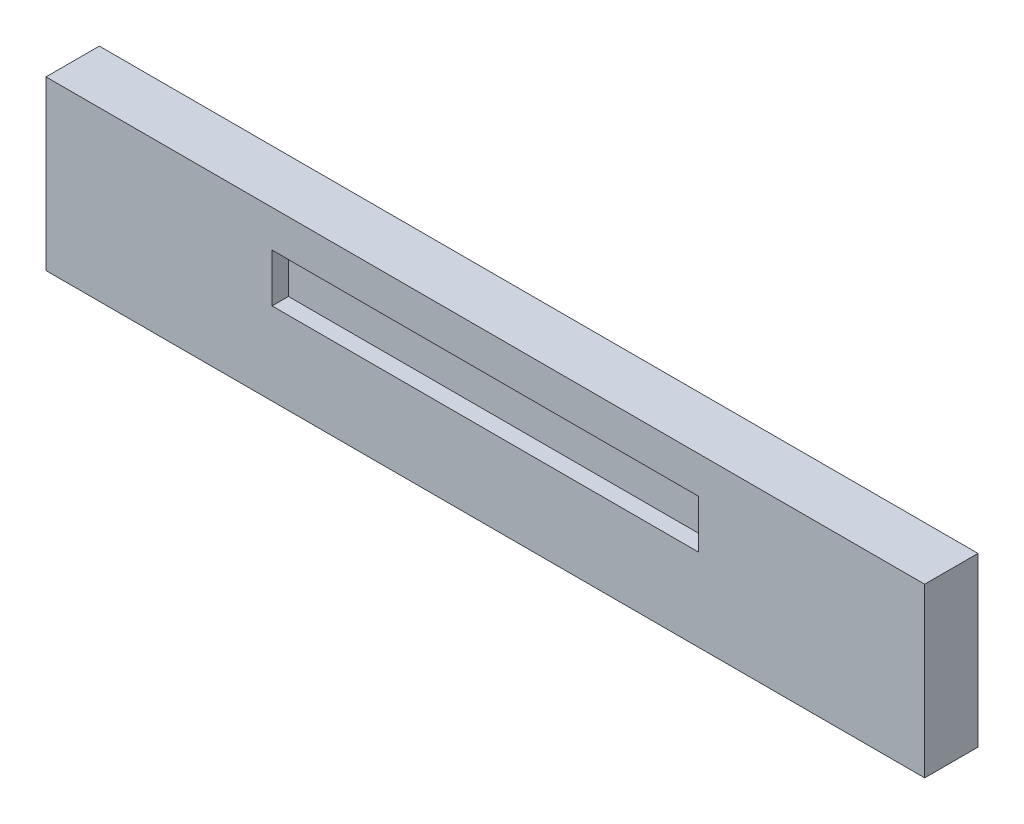
ISO-10303-21;
HEADER;
FILE_DESCRIPTION(('STEP AP214'),'2;1');
FILE_NAME('part.step','',(''),(''),'','','');
FILE_SCHEMA(('AUTOMOTIVE_DESIGN { 1 0 10303 214 1 1 1 1 }'));
ENDSEC;
DATA;
#1=APPLICATION_CONTEXT('core data for automotive mechanical design processes');
#2=APPLICATION_PROTOCOL_DEFINITION('international standard','automotive_design',2000,#1);
#3=PRODUCT_CONTEXT('',#1,'mechanical');
#4=PRODUCT('Part','Part','',(#3));
#5=PRODUCT_RELATED_PRODUCT_CATEGORY('part','',(#4));
#6=PRODUCT_DEFINITION_FORMATION('','',#4);
#7=PRODUCT_DEFINITION_CONTEXT('part definition',#1,'design');
#8=PRODUCT_DEFINITION('design','',#6,#7);
#9=PRODUCT_DEFINITION_SHAPE('','',#8);
#10=(LENGTH_UNIT() NAMED_UNIT(*) SI_UNIT(.MILLI.,.METRE.));
#11=(NAMED_UNIT(*) PLANE_ANGLE_UNIT() SI_UNIT($,.RADIAN.));
#12=(NAMED_UNIT(*) SI_UNIT($,.STERADIAN.) SOLID_ANGLE_UNIT());
#13=UNCERTAINTY_MEASURE_WITH_UNIT(LENGTH_MEASURE(1.E-05),#10,'distance_accuracy_value','');
#14=(GEOMETRIC_REPRESENTATION_CONTEXT(3) GLOBAL_UNCERTAINTY_ASSIGNED_CONTEXT((#13)) GLOBAL_UNIT_ASSIGNED_CONTEXT((#10,
#11,#12)) REPRESENTATION_CONTEXT('',''));
#15=CARTESIAN_POINT('',(0.,0.,0.));
#16=DIRECTION('',(0.,0.,1.));
#17=DIRECTION('',(1.,0.,0.));
#18=AXIS2_PLACEMENT_3D('',#15,#16,#17);
#19=CARTESIAN_POINT('',(0.,0.,38.5));
#20=DIRECTION('',(0.,0.,-1.));
#21=DIRECTION('',(-1.,0.,0.));
#22=AXIS2_PLACEMENT_3D('',#19,#20,#21);
#23=PLANE('',#22);
#24=DIRECTION('',(0.,-1.,0.));
#25=VECTOR('',#24,1.);
#26=CARTESIAN_POINT('',(0.,0.,38.5));
#27=LINE('',#26,#25);
#28=CARTESIAN_POINT('',(0.,118.,38.5));
#29=VERTEX_POINT('',#28);
#30=CARTESIAN_POINT('',(0.,0.,38.5));
#31=VERTEX_POINT('',#30);
#32=EDGE_CURVE('E145',#29,#31,#27,.T.);
#33=ORIENTED_EDGE('',*,*,#32,.T.);
#34=DIRECTION('',(1.,0.,0.));
#35=VECTOR('',#34,1.);
#36=CARTESIAN_POINT('',(0.,0.,38.5));
#37=LINE('',#36,#35);
#38=CARTESIAN_POINT('',(618.,0.,38.5));
#39=VERTEX_POINT('',#38);
#40=EDGE_CURVE('E92',#31,#39,#37,.T.);
#41=ORIENTED_EDGE('',*,*,#40,.T.);
#42=DIRECTION('',(0.,1.,0.));
#43=VECTOR('',#42,1.);
#44=CARTESIAN_POINT('',(618.,0.,38.5));
#45=LINE('',#44,#43);
#46=CARTESIAN_POINT('',(618.,118.,38.5));
#47=VERTEX_POINT('',#46);
#48=EDGE_CURVE('E148',#39,#47,#45,.T.);
#49=ORIENTED_EDGE('',*,*,#48,.T.);
#50=DIRECTION('',(-1.,0.,0.));
#51=VECTOR('',#50,1.);
#52=CARTESIAN_POINT('',(0.,118.,38.5));
#53=LINE('',#52,#51);
#54=EDGE_CURVE('E63',#47,#29,#53,.T.);
#55=ORIENTED_EDGE('',*,*,#54,.T.);
#56=EDGE_LOOP('',(#33,#41,#49,#55));
#57=FACE_BOUND('',#56,.T.);
#58=DIRECTION('',(0.,-1.,0.));
#59=VECTOR('',#58,1.);
#60=CARTESIAN_POINT('',(159.,0.,38.5));
#61=LINE('',#60,#59);
#62=CARTESIAN_POINT('',(159.,92.,38.5));
#63=VERTEX_POINT('',#62);
#64=CARTESIAN_POINT('',(159.,58.,38.5));
#65=VERTEX_POINT('',#64);
#66=EDGE_CURVE('E11',#63,#65,#61,.T.);
#67=ORIENTED_EDGE('',*,*,#66,.F.);
#68=DIRECTION('',(-1.,0.,0.));
#69=VECTOR('',#68,1.);
#70=CARTESIAN_POINT('',(0.,92.,38.5));
#71=LINE('',#70,#69);
#72=CARTESIAN_POINT('',(459.,92.,38.5));
#73=VERTEX_POINT('',#72);
#74=EDGE_CURVE('E167',#73,#63,#71,.T.);
#75=ORIENTED_EDGE('',*,*,#74,.F.);
#76=DIRECTION('',(0.,1.,0.));
#77=VECTOR('',#76,1.);
#78=CARTESIAN_POINT('',(459.,0.,38.5));
#79=LINE('',#78,#77);
#80=CARTESIAN_POINT('',(459.,58.,38.5));
#81=VERTEX_POINT('',#80);
#82=EDGE_CURVE('E169',#81,#73,#79,.T.);
#83=ORIENTED_EDGE('',*,*,#82,.F.);
#84=DIRECTION('',(1.,0.,0.));
#85=VECTOR('',#84,1.);
#86=CARTESIAN_POINT('',(0.,58.,38.5));
#87=LINE('',#86,#85);
#88=EDGE_CURVE('E47',#65,#81,#87,.T.);
#89=ORIENTED_EDGE('',*,*,#88,.F.);
#90=EDGE_LOOP('',(#67,#75,#83,#89));
#91=FACE_BOUND('',#90,.T.);
#92=ADVANCED_FACE('F39',(#57,#91),#23,.F.);
#93=CARTESIAN_POINT('',(0.,0.,38.5));
#94=DIRECTION('',(1.,0.,0.));
#95=DIRECTION('',(0.,0.,-1.));
#96=AXIS2_PLACEMENT_3D('',#93,#94,#95);
#97=PLANE('',#96);
#98=DIRECTION('',(0.,-1.,0.));
#99=VECTOR('',#98,1.);
#100=CARTESIAN_POINT('',(0.,0.,1.));
#101=LINE('',#100,#99);
#102=CARTESIAN_POINT('',(0.,118.,1.));
#103=VERTEX_POINT('',#102);
#104=CARTESIAN_POINT('',(0.,0.,1.));
#105=VERTEX_POINT('',#104);
#106=EDGE_CURVE('E122',#103,#105,#101,.T.);
#107=ORIENTED_EDGE('',*,*,#106,.T.);
#108=DIRECTION('',(0.,0.,-1.));
#109=VECTOR('',#108,1.);
#110=CARTESIAN_POINT('',(0.,0.,38.5));
#111=LINE('',#110,#109);
#112=EDGE_CURVE('E165',#31,#105,#111,.T.);
#113=ORIENTED_EDGE('',*,*,#112,.F.);
#114=ORIENTED_EDGE('',*,*,#32,.F.);
#115=DIRECTION('',(0.,0.,-1.));
#116=VECTOR('',#115,1.);
#117=CARTESIAN_POINT('',(0.,118.,38.5));
#118=LINE('',#117,#116);
#119=EDGE_CURVE('E151',#29,#103,#118,.T.);
#120=ORIENTED_EDGE('',*,*,#119,.T.);
#121=EDGE_LOOP('',(#107,#113,#114,#120));
#122=FACE_BOUND('',#121,.T.);
#123=ADVANCED_FACE('F41',(#122),#97,.F.);
#124=CARTESIAN_POINT('',(0.,0.,38.5));
#125=DIRECTION('',(0.,1.,0.));
#126=DIRECTION('',(0.,0.,1.));
#127=AXIS2_PLACEMENT_3D('',#124,#125,#126);
#128=PLANE('',#127);
#129=DIRECTION('',(1.,0.,0.));
#130=VECTOR('',#129,1.);
#131=CARTESIAN_POINT('',(0.,0.,1.));
#132=LINE('',#131,#130);
#133=CARTESIAN_POINT('',(618.,0.,1.));
#134=VERTEX_POINT('',#133);
#135=EDGE_CURVE('E154',#105,#134,#132,.T.);
#136=ORIENTED_EDGE('',*,*,#135,.T.);
#137=DIRECTION('',(0.,0.,-1.));
#138=VECTOR('',#137,1.);
#139=CARTESIAN_POINT('',(618.,0.,38.5));
#140=LINE('',#139,#138);
#141=EDGE_CURVE('E162',#39,#134,#140,.T.);
#142=ORIENTED_EDGE('',*,*,#141,.F.);
#143=ORIENTED_EDGE('',*,*,#40,.F.);
#144=ORIENTED_EDGE('',*,*,#112,.T.);
#145=EDGE_LOOP('',(#136,#142,#143,#144));
#146=FACE_BOUND('',#145,.T.);
#147=ADVANCED_FACE('F191',(#146),#128,.F.);
#148=CARTESIAN_POINT('',(618.,0.,38.5));
#149=DIRECTION('',(-1.,0.,0.));
#150=DIRECTION('',(0.,0.,1.));
#151=AXIS2_PLACEMENT_3D('',#148,#149,#150);
#152=PLANE('',#151);
#153=DIRECTION('',(0.,1.,0.));
#154=VECTOR('',#153,1.);
#155=CARTESIAN_POINT('',(618.,0.,1.));
#156=LINE('',#155,#154);
#157=CARTESIAN_POINT('',(618.,118.,1.));
#158=VERTEX_POINT('',#157);
#159=EDGE_CURVE('E156',#134,#158,#156,.T.);
#160=ORIENTED_EDGE('',*,*,#159,.T.);
#161=DIRECTION('',(0.,0.,-1.));
#162=VECTOR('',#161,1.);
#163=CARTESIAN_POINT('',(618.,118.,38.5));
#164=LINE('',#163,#162);
#165=EDGE_CURVE('E160',#47,#158,#164,.T.);
#166=ORIENTED_EDGE('',*,*,#165,.F.);
#167=ORIENTED_EDGE('',*,*,#48,.F.);
#168=ORIENTED_EDGE('',*,*,#141,.T.);
#169=EDGE_LOOP('',(#160,#166,#167,#168));
#170=FACE_BOUND('',#169,.T.);
#171=ADVANCED_FACE('F202',(#170),#152,.F.);
#172=CARTESIAN_POINT('',(0.,118.,38.5));
#173=DIRECTION('',(0.,-1.,0.));
#174=DIRECTION('',(0.,0.,-1.));
#175=AXIS2_PLACEMENT_3D('',#172,#173,#174);
#176=PLANE('',#175);
#177=DIRECTION('',(-1.,0.,0.));
#178=VECTOR('',#177,1.);
#179=CARTESIAN_POINT('',(0.,118.,1.));
#180=LINE('',#179,#178);
#181=EDGE_CURVE('E84',#158,#103,#180,.T.);
#182=ORIENTED_EDGE('',*,*,#181,.T.);
#183=ORIENTED_EDGE('',*,*,#119,.F.);
#184=ORIENTED_EDGE('',*,*,#54,.F.);
#185=ORIENTED_EDGE('',*,*,#165,.T.);
#186=EDGE_LOOP('',(#182,#183,#184,#185));
#187=FACE_BOUND('',#186,.T.);
#188=ADVANCED_FACE('F198',(#187),#176,.F.);
#189=CARTESIAN_POINT('',(0.,0.,1.));
#190=DIRECTION('',(0.,0.,-1.));
#191=DIRECTION('',(-1.,0.,0.));
#192=AXIS2_PLACEMENT_3D('',#189,#190,#191);
#193=PLANE('',#192);
#194=ORIENTED_EDGE('',*,*,#106,.F.);
#195=ORIENTED_EDGE('',*,*,#181,.F.);
#196=ORIENTED_EDGE('',*,*,#159,.F.);
#197=ORIENTED_EDGE('',*,*,#135,.F.);
#198=EDGE_LOOP('',(#194,#195,#196,#197));
#199=FACE_BOUND('',#198,.T.);
#200=ADVANCED_FACE('F196',(#199),#193,.T.);
#201=CARTESIAN_POINT('',(159.,58.,41.));
#202=DIRECTION('',(1.,0.,0.));
#203=DIRECTION('',(0.,0.,-1.));
#204=AXIS2_PLACEMENT_3D('',#201,#202,#203);
#205=PLANE('',#204);
#206=ORIENTED_EDGE('',*,*,#66,.T.);
#207=DIRECTION('',(0.,0.,-1.));
#208=VECTOR('',#207,1.);
#209=CARTESIAN_POINT('',(159.,58.,41.));
#210=LINE('',#209,#208);
#211=CARTESIAN_POINT('',(159.,58.,27.));
#212=VERTEX_POINT('',#211);
#213=EDGE_CURVE('E113',#65,#212,#210,.T.);
#214=ORIENTED_EDGE('',*,*,#213,.T.);
#215=DIRECTION('',(0.,-1.,0.));
#216=VECTOR('',#215,1.);
#217=CARTESIAN_POINT('',(159.,58.,27.));
#218=LINE('',#217,#216);
#219=CARTESIAN_POINT('',(159.,92.,27.));
#220=VERTEX_POINT('',#219);
#221=EDGE_CURVE('E118',#220,#212,#218,.T.);
#222=ORIENTED_EDGE('',*,*,#221,.F.);
#223=DIRECTION('',(0.,0.,-1.));
#224=VECTOR('',#223,1.);
#225=CARTESIAN_POINT('',(159.,92.,41.));
#226=LINE('',#225,#224);
#227=EDGE_CURVE('E141',#63,#220,#226,.T.);
#228=ORIENTED_EDGE('',*,*,#227,.F.);
#229=EDGE_LOOP('',(#206,#214,#222,#228));
#230=FACE_BOUND('',#229,.T.);
#231=ADVANCED_FACE('F115',(#230),#205,.T.);
#232=CARTESIAN_POINT('',(159.,58.,41.));
#233=DIRECTION('',(0.,1.,0.));
#234=DIRECTION('',(0.,0.,1.));
#235=AXIS2_PLACEMENT_3D('',#232,#233,#234);
#236=PLANE('',#235);
#237=ORIENTED_EDGE('',*,*,#88,.T.);
#238=DIRECTION('',(0.,0.,-1.));
#239=VECTOR('',#238,1.);
#240=CARTESIAN_POINT('',(459.,58.,41.));
#241=LINE('',#240,#239);
#242=CARTESIAN_POINT('',(459.,58.,27.));
#243=VERTEX_POINT('',#242);
#244=EDGE_CURVE('E123',#81,#243,#241,.T.);
#245=ORIENTED_EDGE('',*,*,#244,.T.);
#246=DIRECTION('',(1.,0.,0.));
#247=VECTOR('',#246,1.);
#248=CARTESIAN_POINT('',(159.,58.,27.));
#249=LINE('',#248,#247);
#250=EDGE_CURVE('E126',#212,#243,#249,.T.);
#251=ORIENTED_EDGE('',*,*,#250,.F.);
#252=ORIENTED_EDGE('',*,*,#213,.F.);
#253=EDGE_LOOP('',(#237,#245,#251,#252));
#254=FACE_BOUND('',#253,.T.);
#255=ADVANCED_FACE('F127',(#254),#236,.T.);
#256=CARTESIAN_POINT('',(459.,58.,41.));
#257=DIRECTION('',(-1.,0.,0.));
#258=DIRECTION('',(0.,0.,1.));
#259=AXIS2_PLACEMENT_3D('',#256,#257,#258);
#260=PLANE('',#259);
#261=ORIENTED_EDGE('',*,*,#82,.T.);
#262=DIRECTION('',(0.,0.,-1.));
#263=VECTOR('',#262,1.);
#264=CARTESIAN_POINT('',(459.,92.,41.));
#265=LINE('',#264,#263);
#266=CARTESIAN_POINT('',(459.,92.,27.));
#267=VERTEX_POINT('',#266);
#268=EDGE_CURVE('E54',#73,#267,#265,.T.);
#269=ORIENTED_EDGE('',*,*,#268,.T.);
#270=DIRECTION('',(0.,1.,0.));
#271=VECTOR('',#270,1.);
#272=CARTESIAN_POINT('',(459.,58.,27.));
#273=LINE('',#272,#271);
#274=EDGE_CURVE('E132',#243,#267,#273,.T.);
#275=ORIENTED_EDGE('',*,*,#274,.F.);
#276=ORIENTED_EDGE('',*,*,#244,.F.);
#277=EDGE_LOOP('',(#261,#269,#275,#276));
#278=FACE_BOUND('',#277,.T.);
#279=ADVANCED_FACE('F173',(#278),#260,.T.);
#280=CARTESIAN_POINT('',(159.,92.,41.));
#281=DIRECTION('',(0.,-1.,0.));
#282=DIRECTION('',(0.,0.,-1.));
#283=AXIS2_PLACEMENT_3D('',#280,#281,#282);
#284=PLANE('',#283);
#285=ORIENTED_EDGE('',*,*,#74,.T.);
#286=ORIENTED_EDGE('',*,*,#227,.T.);
#287=DIRECTION('',(-1.,0.,0.));
#288=VECTOR('',#287,1.);
#289=CARTESIAN_POINT('',(159.,92.,27.));
#290=LINE('',#289,#288);
#291=EDGE_CURVE('E136',#267,#220,#290,.T.);
#292=ORIENTED_EDGE('',*,*,#291,.F.);
#293=ORIENTED_EDGE('',*,*,#268,.F.);
#294=EDGE_LOOP('',(#285,#286,#292,#293));
#295=FACE_BOUND('',#294,.T.);
#296=ADVANCED_FACE('F175',(#295),#284,.T.);
#297=CARTESIAN_POINT('',(0.,0.,27.));
#298=DIRECTION('',(0.,0.,-1.));
#299=DIRECTION('',(-1.,0.,0.));
#300=AXIS2_PLACEMENT_3D('',#297,#298,#299);
#301=PLANE('',#300);
#302=ORIENTED_EDGE('',*,*,#221,.T.);
#303=ORIENTED_EDGE('',*,*,#250,.T.);
#304=ORIENTED_EDGE('',*,*,#274,.T.);
#305=ORIENTED_EDGE('',*,*,#291,.T.);
#306=EDGE_LOOP('',(#302,#303,#304,#305));
#307=FACE_BOUND('',#306,.T.);
#308=ADVANCED_FACE('F135',(#307),#301,.F.);
#309=CLOSED_SHELL('',(#92,#123,#147,#171,#188,#200,#231,#255,#279,#296,#308));
#310=MANIFOLD_SOLID_BREP('B2',#309);
#311=ADVANCED_BREP_SHAPE_REPRESENTATION('',(#18,#310),#14);
#312=SHAPE_DEFINITION_REPRESENTATION(#9,#311);
ENDSEC;
END-ISO-10303-21;
